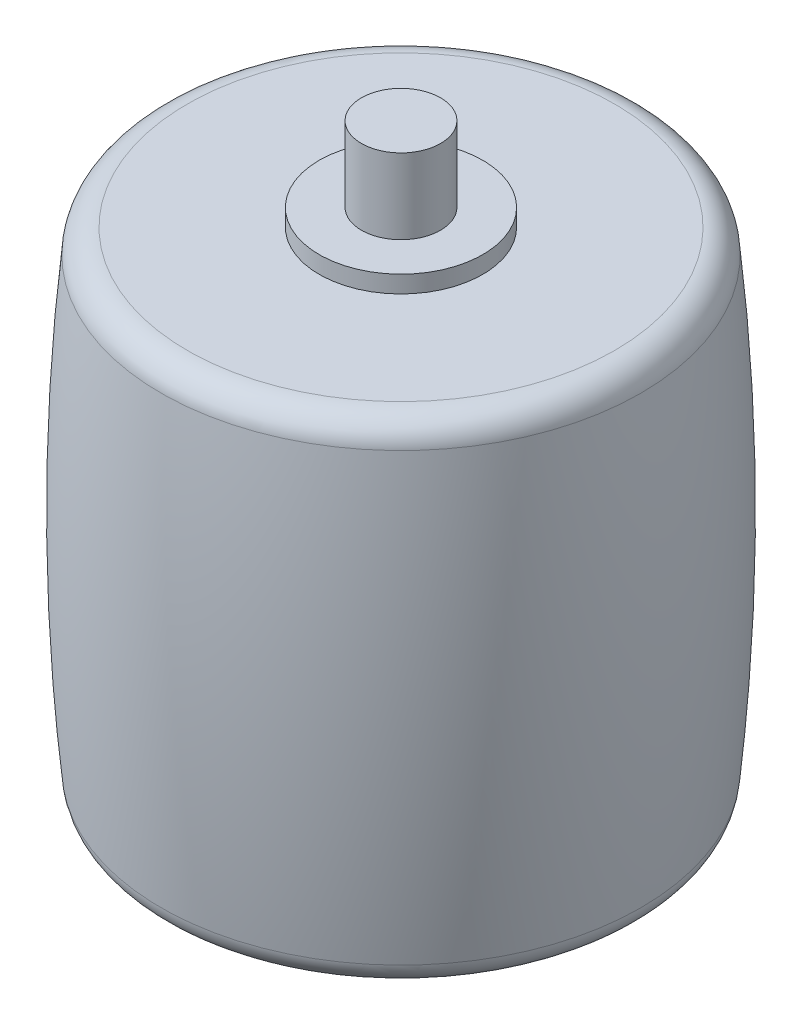
ISO-10303-21;
HEADER;
FILE_DESCRIPTION(('STEP AP214'),'2;1');
FILE_NAME('part.step','',(''),(''),'','','');
FILE_SCHEMA(('AUTOMOTIVE_DESIGN { 1 0 10303 214 1 1 1 1 }'));
ENDSEC;
DATA;
#1=APPLICATION_CONTEXT('core data for automotive mechanical design processes');
#2=APPLICATION_PROTOCOL_DEFINITION('international standard','automotive_design',2000,#1);
#3=PRODUCT_CONTEXT('',#1,'mechanical');
#4=PRODUCT('Part','Part','',(#3));
#5=PRODUCT_RELATED_PRODUCT_CATEGORY('part','',(#4));
#6=PRODUCT_DEFINITION_FORMATION('','',#4);
#7=PRODUCT_DEFINITION_CONTEXT('part definition',#1,'design');
#8=PRODUCT_DEFINITION('design','',#6,#7);
#9=PRODUCT_DEFINITION_SHAPE('','',#8);
#10=(LENGTH_UNIT() NAMED_UNIT(*) SI_UNIT(.MILLI.,.METRE.));
#11=(NAMED_UNIT(*) PLANE_ANGLE_UNIT() SI_UNIT($,.RADIAN.));
#12=(NAMED_UNIT(*) SI_UNIT($,.STERADIAN.) SOLID_ANGLE_UNIT());
#13=UNCERTAINTY_MEASURE_WITH_UNIT(LENGTH_MEASURE(1.E-05),#10,'distance_accuracy_value','');
#14=(GEOMETRIC_REPRESENTATION_CONTEXT(3) GLOBAL_UNCERTAINTY_ASSIGNED_CONTEXT((#13)) GLOBAL_UNIT_ASSIGNED_CONTEXT((#10,
#11,#12)) REPRESENTATION_CONTEXT('',''));
#15=CARTESIAN_POINT('',(0.,0.,0.));
#16=DIRECTION('',(0.,0.,1.));
#17=DIRECTION('',(1.,0.,0.));
#18=AXIS2_PLACEMENT_3D('',#15,#16,#17);
#19=CARTESIAN_POINT('',(0.,12.85,0.));
#20=DIRECTION('',(0.,-1.,0.));
#21=DIRECTION('',(1.,0.,0.));
#22=AXIS2_PLACEMENT_3D('',#19,#20,#21);
#23=PLANE('',#22);
#24=CARTESIAN_POINT('',(0.,12.85,0.));
#25=DIRECTION('',(0.,1.,0.));
#26=DIRECTION('',(-1.,0.,0.));
#27=AXIS2_PLACEMENT_3D('',#24,#25,#26);
#28=CIRCLE('',#27,1.5);
#29=CARTESIAN_POINT('',(-1.5,12.85,0.));
#30=VERTEX_POINT('',#29);
#31=EDGE_CURVE('E67',#30,#30,#28,.T.);
#32=ORIENTED_EDGE('',*,*,#31,.T.);
#33=EDGE_LOOP('',(#32));
#34=FACE_BOUND('',#33,.T.);
#35=ADVANCED_FACE('F43',(#34),#23,.F.);
#36=CARTESIAN_POINT('',(0.,12.85,0.));
#37=DIRECTION('',(0.,1.,0.));
#38=DIRECTION('',(-1.,0.,0.));
#39=AXIS2_PLACEMENT_3D('',#36,#37,#38);
#40=CYLINDRICAL_SURFACE('',#39,1.5);
#41=ORIENTED_EDGE('',*,*,#31,.F.);
#42=EDGE_LOOP('',(#41));
#43=FACE_BOUND('',#42,.T.);
#44=CARTESIAN_POINT('',(0.,10.,0.));
#45=DIRECTION('',(0.,1.,0.));
#46=DIRECTION('',(-1.,0.,0.));
#47=AXIS2_PLACEMENT_3D('',#44,#45,#46);
#48=CIRCLE('',#47,1.50000000000001);
#49=CARTESIAN_POINT('',(-1.50000000000001,10.,0.));
#50=VERTEX_POINT('',#49);
#51=EDGE_CURVE('E71',#50,#50,#48,.T.);
#52=ORIENTED_EDGE('',*,*,#51,.T.);
#53=EDGE_LOOP('',(#52));
#54=FACE_BOUND('',#53,.T.);
#55=ADVANCED_FACE('F116',(#43,#54),#40,.T.);
#56=CARTESIAN_POINT('',(3.1,10.,0.));
#57=DIRECTION('',(0.,-1.,0.));
#58=DIRECTION('',(1.,0.,0.));
#59=AXIS2_PLACEMENT_3D('',#56,#57,#58);
#60=PLANE('',#59);
#61=ORIENTED_EDGE('',*,*,#51,.F.);
#62=EDGE_LOOP('',(#61));
#63=FACE_BOUND('',#62,.T.);
#64=CARTESIAN_POINT('',(0.,10.,0.));
#65=DIRECTION('',(0.,1.,0.));
#66=DIRECTION('',(-1.,0.,0.));
#67=AXIS2_PLACEMENT_3D('',#64,#65,#66);
#68=CIRCLE('',#67,3.1);
#69=CARTESIAN_POINT('',(-3.1,10.,0.));
#70=VERTEX_POINT('',#69);
#71=EDGE_CURVE('E75',#70,#70,#68,.T.);
#72=ORIENTED_EDGE('',*,*,#71,.T.);
#73=EDGE_LOOP('',(#72));
#74=FACE_BOUND('',#73,.T.);
#75=ADVANCED_FACE('F122',(#63,#74),#60,.F.);
#76=CARTESIAN_POINT('',(0.,12.85,0.));
#77=DIRECTION('',(0.,1.,0.));
#78=DIRECTION('',(-1.,0.,0.));
#79=AXIS2_PLACEMENT_3D('',#76,#77,#78);
#80=CYLINDRICAL_SURFACE('',#79,3.1);
#81=ORIENTED_EDGE('',*,*,#71,.F.);
#82=EDGE_LOOP('',(#81));
#83=FACE_BOUND('',#82,.T.);
#84=CARTESIAN_POINT('',(0.,9.35,0.));
#85=DIRECTION('',(0.,1.,0.));
#86=DIRECTION('',(-1.,0.,0.));
#87=AXIS2_PLACEMENT_3D('',#84,#85,#86);
#88=CIRCLE('',#87,3.10000000000001);
#89=CARTESIAN_POINT('',(-3.10000000000001,9.35,0.));
#90=VERTEX_POINT('',#89);
#91=EDGE_CURVE('E79',#90,#90,#88,.T.);
#92=ORIENTED_EDGE('',*,*,#91,.T.);
#93=EDGE_LOOP('',(#92));
#94=FACE_BOUND('',#93,.T.);
#95=ADVANCED_FACE('F128',(#83,#94),#80,.T.);
#96=CARTESIAN_POINT('',(3.1,9.35,0.));
#97=DIRECTION('',(0.,-1.,0.));
#98=DIRECTION('',(1.,0.,0.));
#99=AXIS2_PLACEMENT_3D('',#96,#97,#98);
#100=PLANE('',#99);
#101=CARTESIAN_POINT('',(0.,9.35,0.));
#102=DIRECTION('',(0.,-1.,0.));
#103=DIRECTION('',(1.,0.,0.));
#104=AXIS2_PLACEMENT_3D('',#101,#102,#103);
#105=CIRCLE('',#104,8.09684424376947);
#106=CARTESIAN_POINT('',(8.09684424376947,9.35,0.));
#107=VERTEX_POINT('',#106);
#108=EDGE_CURVE('E10',#107,#107,#105,.F.);
#109=ORIENTED_EDGE('',*,*,#108,.T.);
#110=EDGE_LOOP('',(#109));
#111=FACE_BOUND('',#110,.T.);
#112=ORIENTED_EDGE('',*,*,#91,.F.);
#113=EDGE_LOOP('',(#112));
#114=FACE_BOUND('',#113,.T.);
#115=ADVANCED_FACE('F132',(#111,#114),#100,.F.);
#116=CARTESIAN_POINT('',(0.,0.,0.));
#117=DIRECTION('',(0.,1.,0.));
#118=DIRECTION('',(-1.,0.,0.));
#119=AXIS2_PLACEMENT_3D('',#116,#117,#118);
#120=DEGENERATE_TOROIDAL_SURFACE('',#119,78.1725000000004,87.6725000000004,.F.);
#121=CARTESIAN_POINT('',(0.,-8.44633966944532,0.));
#122=DIRECTION('',(0.,1.,0.));
#123=DIRECTION('',(-1.,0.,0.));
#124=AXIS2_PLACEMENT_3D('',#121,#122,#123);
#125=CIRCLE('',#124,9.09219275966285);
#126=CARTESIAN_POINT('',(-9.09219275966285,-8.44633966944533,0.));
#127=VERTEX_POINT('',#126);
#128=EDGE_CURVE('E56',#127,#127,#125,.T.);
#129=ORIENTED_EDGE('',*,*,#128,.T.);
#130=EDGE_LOOP('',(#129));
#131=FACE_BOUND('',#130,.T.);
#132=CARTESIAN_POINT('',(0.,8.44633966944532,0.));
#133=DIRECTION('',(0.,-1.,0.));
#134=DIRECTION('',(1.,0.,0.));
#135=AXIS2_PLACEMENT_3D('',#132,#133,#134);
#136=CIRCLE('',#135,9.09219275966285);
#137=CARTESIAN_POINT('',(9.09219275966285,8.44633966944533,0.));
#138=VERTEX_POINT('',#137);
#139=EDGE_CURVE('E61',#138,#138,#136,.T.);
#140=ORIENTED_EDGE('',*,*,#139,.T.);
#141=EDGE_LOOP('',(#140));
#142=FACE_BOUND('',#141,.T.);
#143=ADVANCED_FACE('F135',(#131,#142),#120,.F.);
#144=CARTESIAN_POINT('',(3.1,-9.35,0.));
#145=DIRECTION('',(0.,1.,0.));
#146=DIRECTION('',(-1.,0.,0.));
#147=AXIS2_PLACEMENT_3D('',#144,#145,#146);
#148=PLANE('',#147);
#149=CARTESIAN_POINT('',(0.,-9.35,0.));
#150=DIRECTION('',(0.,1.,0.));
#151=DIRECTION('',(-1.,0.,0.));
#152=AXIS2_PLACEMENT_3D('',#149,#150,#151);
#153=CIRCLE('',#152,8.09684424376947);
#154=CARTESIAN_POINT('',(-8.09684424376947,-9.35,0.));
#155=VERTEX_POINT('',#154);
#156=EDGE_CURVE('E51',#155,#155,#153,.F.);
#157=ORIENTED_EDGE('',*,*,#156,.T.);
#158=EDGE_LOOP('',(#157));
#159=FACE_BOUND('',#158,.T.);
#160=CARTESIAN_POINT('',(0.,-9.35,0.));
#161=DIRECTION('',(0.,1.,0.));
#162=DIRECTION('',(-1.,0.,0.));
#163=AXIS2_PLACEMENT_3D('',#160,#161,#162);
#164=CIRCLE('',#163,3.1);
#165=CARTESIAN_POINT('',(-3.1,-9.35,0.));
#166=VERTEX_POINT('',#165);
#167=EDGE_CURVE('E83',#166,#166,#164,.T.);
#168=ORIENTED_EDGE('',*,*,#167,.T.);
#169=EDGE_LOOP('',(#168));
#170=FACE_BOUND('',#169,.T.);
#171=ADVANCED_FACE('F138',(#159,#170),#148,.F.);
#172=CARTESIAN_POINT('',(0.,12.85,0.));
#173=DIRECTION('',(0.,1.,0.));
#174=DIRECTION('',(-1.,0.,0.));
#175=AXIS2_PLACEMENT_3D('',#172,#173,#174);
#176=CYLINDRICAL_SURFACE('',#175,3.1);
#177=ORIENTED_EDGE('',*,*,#167,.F.);
#178=EDGE_LOOP('',(#177));
#179=FACE_BOUND('',#178,.T.);
#180=CARTESIAN_POINT('',(0.,-10.,0.));
#181=DIRECTION('',(0.,1.,0.));
#182=DIRECTION('',(-1.,0.,0.));
#183=AXIS2_PLACEMENT_3D('',#180,#181,#182);
#184=CIRCLE('',#183,3.1);
#185=CARTESIAN_POINT('',(-3.1,-10.,0.));
#186=VERTEX_POINT('',#185);
#187=EDGE_CURVE('E87',#186,#186,#184,.T.);
#188=ORIENTED_EDGE('',*,*,#187,.T.);
#189=EDGE_LOOP('',(#188));
#190=FACE_BOUND('',#189,.T.);
#191=ADVANCED_FACE('F142',(#179,#190),#176,.T.);
#192=CARTESIAN_POINT('',(3.1,-10.,0.));
#193=DIRECTION('',(0.,1.,0.));
#194=DIRECTION('',(-1.,0.,0.));
#195=AXIS2_PLACEMENT_3D('',#192,#193,#194);
#196=PLANE('',#195);
#197=ORIENTED_EDGE('',*,*,#187,.F.);
#198=EDGE_LOOP('',(#197));
#199=FACE_BOUND('',#198,.T.);
#200=CARTESIAN_POINT('',(0.,-9.99999999999999,0.));
#201=DIRECTION('',(0.,1.,0.));
#202=DIRECTION('',(-1.,0.,0.));
#203=AXIS2_PLACEMENT_3D('',#200,#201,#202);
#204=CIRCLE('',#203,1.5);
#205=CARTESIAN_POINT('',(-1.5,-9.99999999999999,0.));
#206=VERTEX_POINT('',#205);
#207=EDGE_CURVE('E91',#206,#206,#204,.T.);
#208=ORIENTED_EDGE('',*,*,#207,.T.);
#209=EDGE_LOOP('',(#208));
#210=FACE_BOUND('',#209,.T.);
#211=ADVANCED_FACE('F112',(#199,#210),#196,.F.);
#212=CARTESIAN_POINT('',(0.,12.85,0.));
#213=DIRECTION('',(0.,1.,0.));
#214=DIRECTION('',(-1.,0.,0.));
#215=AXIS2_PLACEMENT_3D('',#212,#213,#214);
#216=CYLINDRICAL_SURFACE('',#215,1.5);
#217=ORIENTED_EDGE('',*,*,#207,.F.);
#218=EDGE_LOOP('',(#217));
#219=FACE_BOUND('',#218,.T.);
#220=CARTESIAN_POINT('',(0.,-12.85,0.));
#221=DIRECTION('',(0.,1.,0.));
#222=DIRECTION('',(-1.,0.,0.));
#223=AXIS2_PLACEMENT_3D('',#220,#221,#222);
#224=CIRCLE('',#223,1.5);
#225=CARTESIAN_POINT('',(-1.5,-12.85,0.));
#226=VERTEX_POINT('',#225);
#227=EDGE_CURVE('E95',#226,#226,#224,.T.);
#228=ORIENTED_EDGE('',*,*,#227,.T.);
#229=EDGE_LOOP('',(#228));
#230=FACE_BOUND('',#229,.T.);
#231=ADVANCED_FACE('F100',(#219,#230),#216,.T.);
#232=CARTESIAN_POINT('',(0.,-12.85,0.));
#233=DIRECTION('',(0.,1.,0.));
#234=DIRECTION('',(-1.,0.,0.));
#235=AXIS2_PLACEMENT_3D('',#232,#233,#234);
#236=PLANE('',#235);
#237=ORIENTED_EDGE('',*,*,#227,.F.);
#238=EDGE_LOOP('',(#237));
#239=FACE_BOUND('',#238,.T.);
#240=ADVANCED_FACE('F102',(#239),#236,.F.);
#241=CARTESIAN_POINT('',(0.,-8.35,0.));
#242=DIRECTION('',(0.,1.,0.));
#243=DIRECTION('',(-1.,0.,0.));
#244=AXIS2_PLACEMENT_3D('',#241,#242,#243);
#245=TOROIDAL_SURFACE('',#244,8.09684424376947,1.);
#246=ORIENTED_EDGE('',*,*,#156,.F.);
#247=EDGE_LOOP('',(#246));
#248=FACE_BOUND('',#247,.T.);
#249=ORIENTED_EDGE('',*,*,#128,.F.);
#250=EDGE_LOOP('',(#249));
#251=FACE_BOUND('',#250,.T.);
#252=ADVANCED_FACE('F104',(#248,#251),#245,.T.);
#253=CARTESIAN_POINT('',(0.,8.35,0.));
#254=DIRECTION('',(0.,-1.,0.));
#255=DIRECTION('',(1.,0.,0.));
#256=AXIS2_PLACEMENT_3D('',#253,#254,#255);
#257=TOROIDAL_SURFACE('',#256,8.09684424376947,1.);
#258=ORIENTED_EDGE('',*,*,#139,.F.);
#259=EDGE_LOOP('',(#258));
#260=FACE_BOUND('',#259,.T.);
#261=ORIENTED_EDGE('',*,*,#108,.F.);
#262=EDGE_LOOP('',(#261));
#263=FACE_BOUND('',#262,.T.);
#264=ADVANCED_FACE('F45',(#260,#263),#257,.T.);
#265=CLOSED_SHELL('',(#35,#55,#75,#95,#115,#143,#171,#191,#211,#231,#240,#252,#264));
#266=MANIFOLD_SOLID_BREP('B2',#265);
#267=ADVANCED_BREP_SHAPE_REPRESENTATION('',(#18,#266),#14);
#268=SHAPE_DEFINITION_REPRESENTATION(#9,#267);
ENDSEC;
END-ISO-10303-21;
